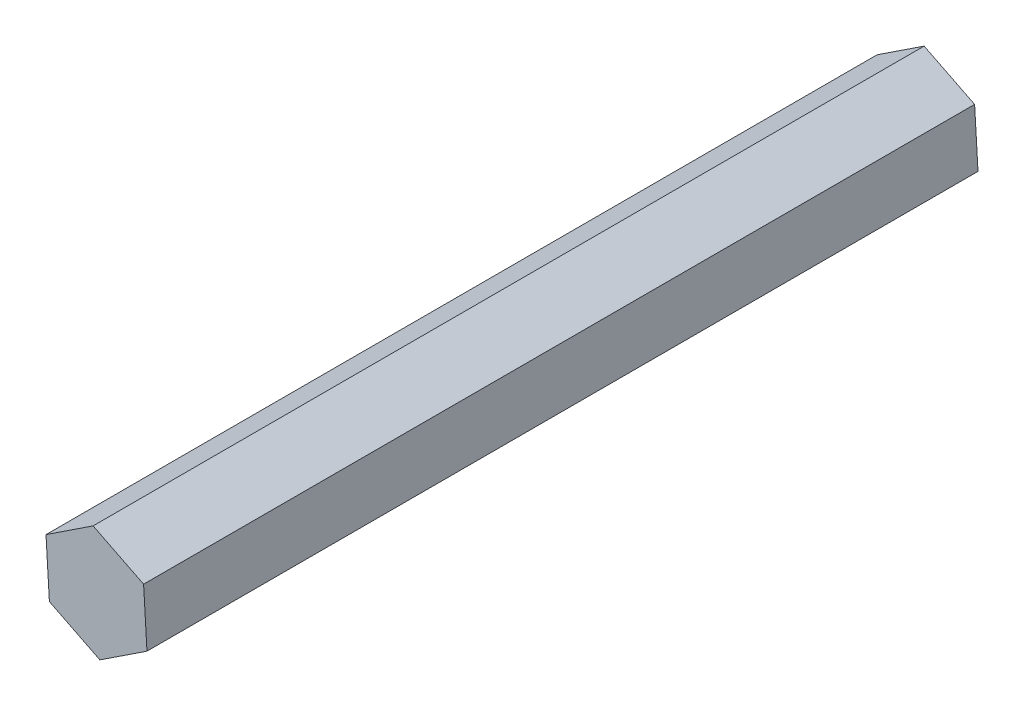
ISO-10303-21;
HEADER;
FILE_DESCRIPTION(('STEP AP214'),'2;1');
FILE_NAME('part.step','',(''),(''),'','','');
FILE_SCHEMA(('AUTOMOTIVE_DESIGN { 1 0 10303 214 1 1 1 1 }'));
ENDSEC;
DATA;
#1=APPLICATION_CONTEXT('core data for automotive mechanical design processes');
#2=APPLICATION_PROTOCOL_DEFINITION('international standard','automotive_design',2000,#1);
#3=PRODUCT_CONTEXT('',#1,'mechanical');
#4=PRODUCT('Part','Part','',(#3));
#5=PRODUCT_RELATED_PRODUCT_CATEGORY('part','',(#4));
#6=PRODUCT_DEFINITION_FORMATION('','',#4);
#7=PRODUCT_DEFINITION_CONTEXT('part definition',#1,'design');
#8=PRODUCT_DEFINITION('design','',#6,#7);
#9=PRODUCT_DEFINITION_SHAPE('','',#8);
#10=(LENGTH_UNIT() NAMED_UNIT(*) SI_UNIT(.MILLI.,.METRE.));
#11=(NAMED_UNIT(*) PLANE_ANGLE_UNIT() SI_UNIT($,.RADIAN.));
#12=(NAMED_UNIT(*) SI_UNIT($,.STERADIAN.) SOLID_ANGLE_UNIT());
#13=UNCERTAINTY_MEASURE_WITH_UNIT(LENGTH_MEASURE(1.E-05),#10,'distance_accuracy_value','');
#14=(GEOMETRIC_REPRESENTATION_CONTEXT(3) GLOBAL_UNCERTAINTY_ASSIGNED_CONTEXT((#13)) GLOBAL_UNIT_ASSIGNED_CONTEXT((#10,
#11,#12)) REPRESENTATION_CONTEXT('',''));
#15=CARTESIAN_POINT('',(0.,0.,0.));
#16=DIRECTION('',(0.,0.,1.));
#17=DIRECTION('',(1.,0.,0.));
#18=AXIS2_PLACEMENT_3D('',#15,#16,#17);
#19=CARTESIAN_POINT('',(-6.11893223121365,-4.04004971295504,107.95));
#20=DIRECTION('',(0.447213595499951,0.89442719099992,0.));
#21=DIRECTION('',(-0.89442719099992,0.447213595499951,0.));
#22=AXIS2_PLACEMENT_3D('',#19,#20,#21);
#23=PLANE('',#22);
#24=DIRECTION('',(0.89442719099992,-0.447213595499951,0.));
#25=VECTOR('',#24,1.);
#26=CARTESIAN_POINT('',(-6.11893223121365,-4.04004971295504,0.));
#27=LINE('',#26,#25);
#28=CARTESIAN_POINT('',(-6.11893223121365,-4.04004971295504,0.));
#29=VERTEX_POINT('',#28);
#30=CARTESIAN_POINT('',(0.439319568364272,-7.31917561274394,0.));
#31=VERTEX_POINT('',#30);
#32=EDGE_CURVE('E117',#29,#31,#27,.T.);
#33=ORIENTED_EDGE('',*,*,#32,.T.);
#34=DIRECTION('',(0.,0.,-1.));
#35=VECTOR('',#34,1.);
#36=CARTESIAN_POINT('',(0.439319568364272,-7.31917561274394,107.95));
#37=LINE('',#36,#35);
#38=CARTESIAN_POINT('',(0.439319568364272,-7.31917561274394,107.95));
#39=VERTEX_POINT('',#38);
#40=EDGE_CURVE('E11',#39,#31,#37,.T.);
#41=ORIENTED_EDGE('',*,*,#40,.F.);
#42=DIRECTION('',(0.89442719099992,-0.447213595499951,0.));
#43=VECTOR('',#42,1.);
#44=CARTESIAN_POINT('',(-6.11893223121365,-4.04004971295504,107.95));
#45=LINE('',#44,#43);
#46=CARTESIAN_POINT('',(-6.11893223121365,-4.04004971295504,107.95));
#47=VERTEX_POINT('',#46);
#48=EDGE_CURVE('E127',#47,#39,#45,.T.);
#49=ORIENTED_EDGE('',*,*,#48,.F.);
#50=DIRECTION('',(0.,0.,-1.));
#51=VECTOR('',#50,1.);
#52=CARTESIAN_POINT('',(-6.11893223121365,-4.04004971295504,107.95));
#53=LINE('',#52,#51);
#54=EDGE_CURVE('E113',#47,#29,#53,.T.);
#55=ORIENTED_EDGE('',*,*,#54,.T.);
#56=EDGE_LOOP('',(#33,#41,#49,#55));
#57=FACE_BOUND('',#56,.T.);
#58=ADVANCED_FACE('F33',(#57),#23,.F.);
#59=CARTESIAN_POINT('',(0.439319568364272,-7.31917561274394,107.95));
#60=DIRECTION('',(-0.550989871491512,0.834511930120695,0.));
#61=DIRECTION('',(-0.834511930120695,-0.550989871491511,0.));
#62=AXIS2_PLACEMENT_3D('',#59,#60,#61);
#63=PLANE('',#62);
#64=DIRECTION('',(0.834511930120695,0.550989871491512,0.));
#65=VECTOR('',#64,1.);
#66=CARTESIAN_POINT('',(0.439319568364272,-7.31917561274394,0.));
#67=LINE('',#66,#65);
#68=CARTESIAN_POINT('',(6.55825179957792,-3.27912589978889,0.));
#69=VERTEX_POINT('',#68);
#70=EDGE_CURVE('E120',#31,#69,#67,.T.);
#71=ORIENTED_EDGE('',*,*,#70,.T.);
#72=DIRECTION('',(0.,0.,-1.));
#73=VECTOR('',#72,1.);
#74=CARTESIAN_POINT('',(6.55825179957792,-3.27912589978889,107.95));
#75=LINE('',#74,#73);
#76=CARTESIAN_POINT('',(6.55825179957792,-3.27912589978889,107.95));
#77=VERTEX_POINT('',#76);
#78=EDGE_CURVE('E41',#77,#69,#75,.T.);
#79=ORIENTED_EDGE('',*,*,#78,.F.);
#80=DIRECTION('',(0.834511930120695,0.550989871491512,0.));
#81=VECTOR('',#80,1.);
#82=CARTESIAN_POINT('',(0.439319568364272,-7.31917561274394,107.95));
#83=LINE('',#82,#81);
#84=EDGE_CURVE('E86',#39,#77,#83,.T.);
#85=ORIENTED_EDGE('',*,*,#84,.F.);
#86=ORIENTED_EDGE('',*,*,#40,.T.);
#87=EDGE_LOOP('',(#71,#79,#85,#86));
#88=FACE_BOUND('',#87,.T.);
#89=ADVANCED_FACE('F151',(#88),#63,.F.);
#90=CARTESIAN_POINT('',(6.55825179957792,-3.27912589978889,107.95));
#91=DIRECTION('',(-0.998203466991462,-0.0599152608792239,0.));
#92=DIRECTION('',(0.0599152608792239,-0.998203466991462,0.));
#93=AXIS2_PLACEMENT_3D('',#90,#91,#92);
#94=PLANE('',#93);
#95=DIRECTION('',(-0.0599152608792239,0.998203466991462,0.));
#96=VECTOR('',#95,1.);
#97=CARTESIAN_POINT('',(6.55825179957792,-3.27912589978889,0.));
#98=LINE('',#97,#96);
#99=CARTESIAN_POINT('',(6.11893223121365,4.04004971295504,0.));
#100=VERTEX_POINT('',#99);
#101=EDGE_CURVE('E122',#69,#100,#98,.T.);
#102=ORIENTED_EDGE('',*,*,#101,.T.);
#103=DIRECTION('',(0.,0.,-1.));
#104=VECTOR('',#103,1.);
#105=CARTESIAN_POINT('',(6.11893223121365,4.04004971295504,107.95));
#106=LINE('',#105,#104);
#107=CARTESIAN_POINT('',(6.11893223121365,4.04004971295504,107.95));
#108=VERTEX_POINT('',#107);
#109=EDGE_CURVE('E108',#108,#100,#106,.T.);
#110=ORIENTED_EDGE('',*,*,#109,.F.);
#111=DIRECTION('',(-0.0599152608792239,0.998203466991462,0.));
#112=VECTOR('',#111,1.);
#113=CARTESIAN_POINT('',(6.55825179957792,-3.27912589978889,107.95));
#114=LINE('',#113,#112);
#115=EDGE_CURVE('E99',#77,#108,#114,.T.);
#116=ORIENTED_EDGE('',*,*,#115,.F.);
#117=ORIENTED_EDGE('',*,*,#78,.T.);
#118=EDGE_LOOP('',(#102,#110,#116,#117));
#119=FACE_BOUND('',#118,.T.);
#120=ADVANCED_FACE('F133',(#119),#94,.F.);
#121=CARTESIAN_POINT('',(6.11893223121365,4.04004971295504,107.95));
#122=DIRECTION('',(-0.447213595499951,-0.894427190999919,0.));
#123=DIRECTION('',(0.89442719099992,-0.447213595499951,0.));
#124=AXIS2_PLACEMENT_3D('',#121,#122,#123);
#125=PLANE('',#124);
#126=DIRECTION('',(-0.89442719099992,0.447213595499951,0.));
#127=VECTOR('',#126,1.);
#128=CARTESIAN_POINT('',(6.11893223121365,4.04004971295504,0.));
#129=LINE('',#128,#127);
#130=CARTESIAN_POINT('',(-0.439319568364271,7.31917561274394,0.));
#131=VERTEX_POINT('',#130);
#132=EDGE_CURVE('E107',#100,#131,#129,.T.);
#133=ORIENTED_EDGE('',*,*,#132,.T.);
#134=DIRECTION('',(0.,0.,-1.));
#135=VECTOR('',#134,1.);
#136=CARTESIAN_POINT('',(-0.439319568364271,7.31917561274394,107.95));
#137=LINE('',#136,#135);
#138=CARTESIAN_POINT('',(-0.439319568364271,7.31917561274394,107.95));
#139=VERTEX_POINT('',#138);
#140=EDGE_CURVE('E104',#139,#131,#137,.T.);
#141=ORIENTED_EDGE('',*,*,#140,.F.);
#142=DIRECTION('',(-0.89442719099992,0.447213595499951,0.));
#143=VECTOR('',#142,1.);
#144=CARTESIAN_POINT('',(6.11893223121365,4.04004971295504,107.95));
#145=LINE('',#144,#143);
#146=EDGE_CURVE('E93',#108,#139,#145,.T.);
#147=ORIENTED_EDGE('',*,*,#146,.F.);
#148=ORIENTED_EDGE('',*,*,#109,.T.);
#149=EDGE_LOOP('',(#133,#141,#147,#148));
#150=FACE_BOUND('',#149,.T.);
#151=ADVANCED_FACE('F105',(#150),#125,.F.);
#152=CARTESIAN_POINT('',(-0.439319568364271,7.31917561274394,107.95));
#153=DIRECTION('',(0.550989871491511,-0.834511930120695,0.));
#154=DIRECTION('',(0.834511930120695,0.550989871491511,0.));
#155=AXIS2_PLACEMENT_3D('',#152,#153,#154);
#156=PLANE('',#155);
#157=DIRECTION('',(-0.834511930120695,-0.550989871491511,0.));
#158=VECTOR('',#157,1.);
#159=CARTESIAN_POINT('',(-0.439319568364271,7.31917561274394,0.));
#160=LINE('',#159,#158);
#161=CARTESIAN_POINT('',(-6.55825179957792,3.27912589978889,0.));
#162=VERTEX_POINT('',#161);
#163=EDGE_CURVE('E72',#131,#162,#160,.T.);
#164=ORIENTED_EDGE('',*,*,#163,.T.);
#165=DIRECTION('',(0.,0.,-1.));
#166=VECTOR('',#165,1.);
#167=CARTESIAN_POINT('',(-6.55825179957792,3.27912589978889,107.95));
#168=LINE('',#167,#166);
#169=CARTESIAN_POINT('',(-6.55825179957792,3.27912589978889,107.95));
#170=VERTEX_POINT('',#169);
#171=EDGE_CURVE('E109',#170,#162,#168,.T.);
#172=ORIENTED_EDGE('',*,*,#171,.F.);
#173=DIRECTION('',(-0.834511930120695,-0.550989871491511,0.));
#174=VECTOR('',#173,1.);
#175=CARTESIAN_POINT('',(-0.439319568364271,7.31917561274394,107.95));
#176=LINE('',#175,#174);
#177=EDGE_CURVE('E97',#139,#170,#176,.T.);
#178=ORIENTED_EDGE('',*,*,#177,.F.);
#179=ORIENTED_EDGE('',*,*,#140,.T.);
#180=EDGE_LOOP('',(#164,#172,#178,#179));
#181=FACE_BOUND('',#180,.T.);
#182=ADVANCED_FACE('F111',(#181),#156,.F.);
#183=CARTESIAN_POINT('',(-6.55825179957792,3.27912589978889,107.95));
#184=DIRECTION('',(0.998203466991462,0.0599152608792248,0.));
#185=DIRECTION('',(-0.0599152608792248,0.998203466991462,0.));
#186=AXIS2_PLACEMENT_3D('',#183,#184,#185);
#187=PLANE('',#186);
#188=DIRECTION('',(0.0599152608792248,-0.998203466991462,0.));
#189=VECTOR('',#188,1.);
#190=CARTESIAN_POINT('',(-6.55825179957792,3.27912589978889,0.));
#191=LINE('',#190,#189);
#192=EDGE_CURVE('E78',#162,#29,#191,.T.);
#193=ORIENTED_EDGE('',*,*,#192,.T.);
#194=ORIENTED_EDGE('',*,*,#54,.F.);
#195=DIRECTION('',(0.0599152608792248,-0.998203466991462,0.));
#196=VECTOR('',#195,1.);
#197=CARTESIAN_POINT('',(-6.55825179957792,3.27912589978889,107.95));
#198=LINE('',#197,#196);
#199=EDGE_CURVE('E49',#170,#47,#198,.T.);
#200=ORIENTED_EDGE('',*,*,#199,.F.);
#201=ORIENTED_EDGE('',*,*,#171,.T.);
#202=EDGE_LOOP('',(#193,#194,#200,#201));
#203=FACE_BOUND('',#202,.T.);
#204=ADVANCED_FACE('F140',(#203),#187,.F.);
#205=CARTESIAN_POINT('',(0.,0.,107.95));
#206=DIRECTION('',(0.,0.,1.));
#207=DIRECTION('',(1.,0.,0.));
#208=AXIS2_PLACEMENT_3D('',#205,#206,#207);
#209=PLANE('',#208);
#210=ORIENTED_EDGE('',*,*,#48,.T.);
#211=ORIENTED_EDGE('',*,*,#84,.T.);
#212=ORIENTED_EDGE('',*,*,#115,.T.);
#213=ORIENTED_EDGE('',*,*,#146,.T.);
#214=ORIENTED_EDGE('',*,*,#177,.T.);
#215=ORIENTED_EDGE('',*,*,#199,.T.);
#216=EDGE_LOOP('',(#210,#211,#212,#213,#214,#215));
#217=FACE_BOUND('',#216,.T.);
#218=ADVANCED_FACE('F95',(#217),#209,.T.);
#219=CARTESIAN_POINT('',(0.,0.,0.));
#220=DIRECTION('',(0.,0.,1.));
#221=DIRECTION('',(1.,0.,0.));
#222=AXIS2_PLACEMENT_3D('',#219,#220,#221);
#223=PLANE('',#222);
#224=ORIENTED_EDGE('',*,*,#32,.F.);
#225=ORIENTED_EDGE('',*,*,#192,.F.);
#226=ORIENTED_EDGE('',*,*,#163,.F.);
#227=ORIENTED_EDGE('',*,*,#132,.F.);
#228=ORIENTED_EDGE('',*,*,#101,.F.);
#229=ORIENTED_EDGE('',*,*,#70,.F.);
#230=EDGE_LOOP('',(#224,#225,#226,#227,#228,#229));
#231=FACE_BOUND('',#230,.T.);
#232=ADVANCED_FACE('F136',(#231),#223,.F.);
#233=CLOSED_SHELL('',(#58,#89,#120,#151,#182,#204,#218,#232));
#234=MANIFOLD_SOLID_BREP('B2',#233);
#235=ADVANCED_BREP_SHAPE_REPRESENTATION('',(#18,#234),#14);
#236=SHAPE_DEFINITION_REPRESENTATION(#9,#235);
ENDSEC;
END-ISO-10303-21;
